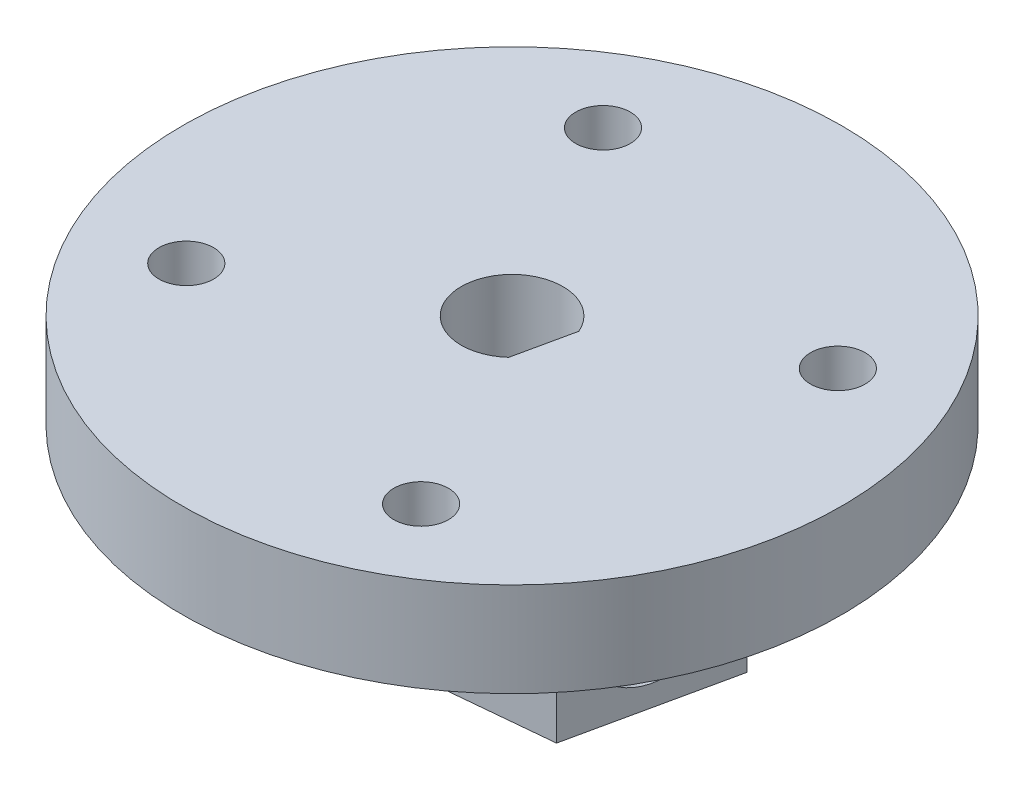
ISO-10303-21;
HEADER;
FILE_DESCRIPTION(('STEP AP214'),'2;1');
FILE_NAME('part.step','',(''),(''),'','','');
FILE_SCHEMA(('AUTOMOTIVE_DESIGN { 1 0 10303 214 1 1 1 1 }'));
ENDSEC;
DATA;
#1=APPLICATION_CONTEXT('core data for automotive mechanical design processes');
#2=APPLICATION_PROTOCOL_DEFINITION('international standard','automotive_design',2000,#1);
#3=PRODUCT_CONTEXT('',#1,'mechanical');
#4=PRODUCT('Part','Part','',(#3));
#5=PRODUCT_RELATED_PRODUCT_CATEGORY('part','',(#4));
#6=PRODUCT_DEFINITION_FORMATION('','',#4);
#7=PRODUCT_DEFINITION_CONTEXT('part definition',#1,'design');
#8=PRODUCT_DEFINITION('design','',#6,#7);
#9=PRODUCT_DEFINITION_SHAPE('','',#8);
#10=(LENGTH_UNIT() NAMED_UNIT(*) SI_UNIT(.MILLI.,.METRE.));
#11=(NAMED_UNIT(*) PLANE_ANGLE_UNIT() SI_UNIT($,.RADIAN.));
#12=(NAMED_UNIT(*) SI_UNIT($,.STERADIAN.) SOLID_ANGLE_UNIT());
#13=UNCERTAINTY_MEASURE_WITH_UNIT(LENGTH_MEASURE(1.E-05),#10,'distance_accuracy_value','');
#14=(GEOMETRIC_REPRESENTATION_CONTEXT(3) GLOBAL_UNCERTAINTY_ASSIGNED_CONTEXT((#13)) GLOBAL_UNIT_ASSIGNED_CONTEXT((#10,
#11,#12)) REPRESENTATION_CONTEXT('',''));
#15=CARTESIAN_POINT('',(0.,0.,0.));
#16=DIRECTION('',(0.,0.,1.));
#17=DIRECTION('',(1.,0.,0.));
#18=AXIS2_PLACEMENT_3D('',#15,#16,#17);
#19=CARTESIAN_POINT('',(0.,10.,0.));
#20=DIRECTION('',(0.,-1.,0.));
#21=DIRECTION('',(0.,0.,-1.));
#22=AXIS2_PLACEMENT_3D('',#19,#20,#21);
#23=PLANE('',#22);
#24=CARTESIAN_POINT('',(0.,10.,1.08481243826419E-13));
#25=DIRECTION('',(0.,-1.,0.));
#26=DIRECTION('',(0.,0.,-1.));
#27=AXIS2_PLACEMENT_3D('',#24,#25,#26);
#28=CIRCLE('',#27,17.5);
#29=CARTESIAN_POINT('',(0.,10.,-17.4999999999999));
#30=VERTEX_POINT('',#29);
#31=EDGE_CURVE('E300',#30,#30,#28,.T.);
#32=ORIENTED_EDGE('',*,*,#31,.T.);
#33=EDGE_LOOP('',(#32));
#34=FACE_BOUND('',#33,.T.);
#35=CARTESIAN_POINT('',(11.0643329124599,10.,-6.23462406262448));
#36=DIRECTION('',(0.,-1.,0.));
#37=DIRECTION('',(0.,0.,-1.));
#38=AXIS2_PLACEMENT_3D('',#35,#36,#37);
#39=CIRCLE('',#38,1.45);
#40=CARTESIAN_POINT('',(11.0643329124599,10.,-7.68462406262448));
#41=VERTEX_POINT('',#40);
#42=EDGE_CURVE('E296',#41,#41,#39,.T.);
#43=ORIENTED_EDGE('',*,*,#42,.F.);
#44=EDGE_LOOP('',(#43));
#45=FACE_BOUND('',#44,.T.);
#46=CARTESIAN_POINT('',(-6.23462406262453,10.,-11.0643329124599));
#47=DIRECTION('',(0.,-1.,0.));
#48=DIRECTION('',(0.,0.,-1.));
#49=AXIS2_PLACEMENT_3D('',#46,#47,#48);
#50=CIRCLE('',#49,1.4500000000001);
#51=CARTESIAN_POINT('',(-6.23462406262453,10.,-12.51433291246));
#52=VERTEX_POINT('',#51);
#53=EDGE_CURVE('E293',#52,#52,#50,.T.);
#54=ORIENTED_EDGE('',*,*,#53,.F.);
#55=EDGE_LOOP('',(#54));
#56=FACE_BOUND('',#55,.T.);
#57=CARTESIAN_POINT('',(-11.06433291246,10.,6.23462406262441));
#58=DIRECTION('',(0.,-1.,0.));
#59=DIRECTION('',(0.,0.,-1.));
#60=AXIS2_PLACEMENT_3D('',#57,#58,#59);
#61=CIRCLE('',#60,1.45);
#62=CARTESIAN_POINT('',(-11.06433291246,10.,4.78462406262441));
#63=VERTEX_POINT('',#62);
#64=EDGE_CURVE('E288',#63,#63,#61,.T.);
#65=ORIENTED_EDGE('',*,*,#64,.F.);
#66=EDGE_LOOP('',(#65));
#67=FACE_BOUND('',#66,.T.);
#68=CARTESIAN_POINT('',(6.23462406262441,10.,11.06433291246));
#69=DIRECTION('',(0.,-1.,0.));
#70=DIRECTION('',(0.,0.,-1.));
#71=AXIS2_PLACEMENT_3D('',#68,#69,#70);
#72=CIRCLE('',#71,1.45);
#73=CARTESIAN_POINT('',(6.23462406262441,10.,9.61433291245996));
#74=VERTEX_POINT('',#73);
#75=EDGE_CURVE('E284',#74,#74,#72,.T.);
#76=ORIENTED_EDGE('',*,*,#75,.F.);
#77=EDGE_LOOP('',(#76));
#78=FACE_BOUND('',#77,.T.);
#79=DIRECTION('',(-0.211873077029416,0.,0.97729719084324));
#80=VECTOR('',#79,1.);
#81=CARTESIAN_POINT('',(10.1682887570576,10.,-1.12067111727627));
#82=LINE('',#81,#80);
#83=CARTESIAN_POINT('',(10.3801618340876,10.,-2.09796830812233));
#84=VERTEX_POINT('',#83);
#85=CARTESIAN_POINT('',(8.5775136967429,10.,6.21702378717451));
#86=VERTEX_POINT('',#85);
#87=EDGE_CURVE('E221',#84,#86,#82,.T.);
#88=ORIENTED_EDGE('',*,*,#87,.F.);
#89=DIRECTION('',(0.866473418839005,0.,0.499223211044365));
#90=VECTOR('',#89,1.);
#91=CARTESIAN_POINT('',(3.49448833993198,10.,-6.06518525582902));
#92=LINE('',#91,#90);
#93=CARTESIAN_POINT('',(3.53399662575893,10.,-6.04242234944949));
#94=VERTEX_POINT('',#93);
#95=EDGE_CURVE('E198',#94,#84,#92,.T.);
#96=ORIENTED_EDGE('',*,*,#95,.F.);
#97=CARTESIAN_POINT('',(0.,10.,0.));
#98=DIRECTION('',(0.,-1.,0.));
#99=DIRECTION('',(0.,0.,-1.));
#100=AXIS2_PLACEMENT_3D('',#97,#98,#99);
#101=CIRCLE('',#100,7.00000000000016);
#102=CARTESIAN_POINT('',(0.699575959811636,10.,6.96495466435036));
#103=VERTEX_POINT('',#102);
#104=EDGE_CURVE('E279',#103,#94,#101,.T.);
#105=ORIENTED_EDGE('',*,*,#104,.F.);
#106=DIRECTION('',(0.995523444357466,0.,-0.0945149286337774));
#107=VECTOR('',#106,1.);
#108=CARTESIAN_POINT('',(0.661594673640218,10.,6.96856060509667));
#109=LINE('',#108,#107);
#110=EDGE_CURVE('E208',#103,#86,#109,.T.);
#111=ORIENTED_EDGE('',*,*,#110,.T.);
#112=EDGE_LOOP('',(#88,#96,#105,#111));
#113=FACE_BOUND('',#112,.T.);
#114=ADVANCED_FACE('F41',(#34,#45,#56,#67,#78,#113),#23,.T.);
#115=CARTESIAN_POINT('',(0.,-15.8714319372794,0.));
#116=DIRECTION('',(0.,1.,0.));
#117=DIRECTION('',(0.,0.,1.));
#118=AXIS2_PLACEMENT_3D('',#115,#116,#117);
#119=CYLINDRICAL_SURFACE('',#118,7.00000000000016);
#120=DIRECTION('',(0.,-1.,0.));
#121=VECTOR('',#120,1.);
#122=CARTESIAN_POINT('',(3.53399662575893,18.4600914467693,-6.04242234944949));
#123=LINE('',#122,#121);
#124=CARTESIAN_POINT('',(3.53399662575893,2.75,-6.04242234944949));
#125=VERTEX_POINT('',#124);
#126=EDGE_CURVE('E197',#94,#125,#123,.T.);
#127=ORIENTED_EDGE('',*,*,#126,.T.);
#128=CARTESIAN_POINT('',(0.,2.75,0.));
#129=DIRECTION('',(0.,-1.,0.));
#130=DIRECTION('',(0.,0.,-1.));
#131=AXIS2_PLACEMENT_3D('',#128,#129,#130);
#132=CIRCLE('',#131,7.00000000000015);
#133=CARTESIAN_POINT('',(0.699575959811636,2.75,6.96495466435036));
#134=VERTEX_POINT('',#133);
#135=EDGE_CURVE('E189',#134,#125,#132,.T.);
#136=ORIENTED_EDGE('',*,*,#135,.F.);
#137=DIRECTION('',(0.,-1.,0.));
#138=VECTOR('',#137,1.);
#139=CARTESIAN_POINT('',(0.699575959811636,18.4600914467693,6.96495466435036));
#140=LINE('',#139,#138);
#141=EDGE_CURVE('E213',#103,#134,#140,.T.);
#142=ORIENTED_EDGE('',*,*,#141,.F.);
#143=ORIENTED_EDGE('',*,*,#104,.T.);
#144=EDGE_LOOP('',(#127,#136,#142,#143));
#145=FACE_BOUND('',#144,.T.);
#146=ADVANCED_FACE('F266',(#145),#119,.T.);
#147=CARTESIAN_POINT('',(-0.781837752674611,6.87499999999999,-0.169498461623525));
#148=DIRECTION('',(0.97729719084324,0.,0.211873077029416));
#149=DIRECTION('',(0.211873077029416,0.,-0.97729719084324));
#150=AXIS2_PLACEMENT_3D('',#147,#148,#149);
#151=CYLINDRICAL_SURFACE('',#150,1.7);
#152=CARTESIAN_POINT('',(5.47286426872212,6.87499999999999,1.18648923136474));
#153=DIRECTION('',(0.977297190843239,0.,0.211873077029417));
#154=DIRECTION('',(0.211873077029417,0.,-0.977297190843239));
#155=AXIS2_PLACEMENT_3D('',#152,#153,#154);
#156=CIRCLE('',#155,1.7);
#157=CARTESIAN_POINT('',(5.83304849967213,6.87499999999999,-0.474915993068771));
#158=VERTEX_POINT('',#157);
#159=EDGE_CURVE('E255',#158,#158,#156,.F.);
#160=ORIENTED_EDGE('',*,*,#159,.T.);
#161=EDGE_LOOP('',(#160));
#162=FACE_BOUND('',#161,.T.);
#163=CARTESIAN_POINT('',(6.54789117864969,6.87499999999999,1.41954961609709));
#164=DIRECTION('',(0.97729719084324,0.,0.211873077029416));
#165=DIRECTION('',(0.211873077029416,0.,-0.97729719084324));
#166=AXIS2_PLACEMENT_3D('',#163,#164,#165);
#167=CIRCLE('',#166,1.7);
#168=CARTESIAN_POINT('',(6.90807540959969,6.87499999999999,-0.241855608336414));
#169=VERTEX_POINT('',#168);
#170=EDGE_CURVE('E45',#169,#169,#167,.F.);
#171=ORIENTED_EDGE('',*,*,#170,.F.);
#172=EDGE_LOOP('',(#171));
#173=FACE_BOUND('',#172,.T.);
#174=ADVANCED_FACE('F260',(#162,#173),#151,.F.);
#175=CARTESIAN_POINT('',(2.1500538198551,6.87499999999999,0.466120769464721));
#176=DIRECTION('',(0.977297190843239,0.,0.211873077029416));
#177=DIRECTION('',(0.211873077029416,0.,-0.977297190843239));
#178=AXIS2_PLACEMENT_3D('',#175,#176,#177);
#179=CIRCLE('',#178,1.7);
#180=CARTESIAN_POINT('',(2.48168764184298,7.53832495807103,-1.06359129759684));
#181=VERTEX_POINT('',#180);
#182=CARTESIAN_POINT('',(1.81841999786719,7.53832495807062,1.99583283652646));
#183=VERTEX_POINT('',#182);
#184=EDGE_CURVE('E59',#181,#183,#179,.T.);
#185=ORIENTED_EDGE('',*,*,#184,.F.);
#186=CARTESIAN_POINT('',(2.48168764184298,6.21167504192895,-1.06359129759684));
#187=CARTESIAN_POINT('',(2.47445290257998,6.24699142231365,-1.08047131098492));
#188=CARTESIAN_POINT('',(2.46754206408533,6.28295353629968,-1.09612227637523));
#189=CARTESIAN_POINT('',(2.45459933639451,6.35609595390477,-1.12480636760794));
#190=CARTESIAN_POINT('',(2.44856823320057,6.39327731097775,-1.13783715633157));
#191=CARTESIAN_POINT('',(2.43219337228819,6.50621811610238,-1.17264760187369));
#192=CARTESIAN_POINT('',(2.42352185429033,6.58358733933576,-1.19024858600394));
#193=CARTESIAN_POINT('',(2.41219775727491,6.74107215220095,-1.21304415122782));
#194=CARTESIAN_POINT('',(2.40958248542305,6.82120169476091,-1.21816184406719));
#195=CARTESIAN_POINT('',(2.41101179546206,6.98117662212737,-1.21532758054758));
#196=CARTESIAN_POINT('',(2.41505579519047,7.06102203116167,-1.20737676665514));
#197=CARTESIAN_POINT('',(2.42819073000947,7.20888705818493,-1.18071188537276));
#198=CARTESIAN_POINT('',(2.43665278423215,7.27721610205841,-1.16333021064468));
#199=CARTESIAN_POINT('',(2.45694675597383,7.41054720697866,-1.11979999022931));
#200=CARTESIAN_POINT('',(2.46877984205136,7.47554810509935,-1.09364840391944));
#201=CARTESIAN_POINT('',(2.48168764184298,7.53832495807103,-1.06359129759684));
#202=B_SPLINE_CURVE_WITH_KNOTS('',3,(#186,#187,#188,#189,#190,#191,#192,#193,#194,#195,#196,
#197,#198,#199,#200,#201),.UNSPECIFIED.,.F.,.F.,(4,2,2,2,2,2,2,4),(0.,0.119371190949202,
0.238848389642147,0.477087032550907,0.716789392903389,0.956470799266007,1.16878940235321,
1.38118169481965),.UNSPECIFIED.);
#203=CARTESIAN_POINT('',(2.48168764184298,6.21167504192895,-1.06359129759684));
#204=VERTEX_POINT('',#203);
#205=EDGE_CURVE('E246',#204,#181,#202,.T.);
#206=ORIENTED_EDGE('',*,*,#205,.F.);
#207=CARTESIAN_POINT('',(1.81841999786719,6.21167504192937,1.99583283652646));
#208=VERTEX_POINT('',#207);
#209=EDGE_CURVE('E254',#208,#204,#179,.T.);
#210=ORIENTED_EDGE('',*,*,#209,.F.);
#211=CARTESIAN_POINT('',(1.81841999786719,7.53832495807062,1.99583283652646));
#212=CARTESIAN_POINT('',(1.80484434522516,7.50300857768591,2.00820126243795));
#213=CARTESIAN_POINT('',(1.79207249405061,7.46704646369987,2.01958512048004));
#214=CARTESIAN_POINT('',(1.76841294380592,7.39390404609478,2.04033402339423));
#215=CARTESIAN_POINT('',(1.75752692803188,7.3567226890218,2.04969726647892));
#216=CARTESIAN_POINT('',(1.72820630071307,7.24378188389716,2.07460116180412));
#217=CARTESIAN_POINT('',(1.71302429123172,7.16641266066378,2.08703082209102));
#218=CARTESIAN_POINT('',(1.69327664163661,7.00892784779859,2.1030901901532));
#219=CARTESIAN_POINT('',(1.68877680065572,6.92879830523863,2.10666536259711));
#220=CARTESIAN_POINT('',(1.69125152867011,6.76882337787219,2.10467747473777));
#221=CARTESIAN_POINT('',(1.69822509464469,6.68897796883789,2.09911521324138));
#222=CARTESIAN_POINT('',(1.72122338839398,6.54111294181479,2.0802838327523));
#223=CARTESIAN_POINT('',(1.73612391813274,6.47278389794146,2.06796704780153));
#224=CARTESIAN_POINT('',(1.7726228817807,6.33945279302149,2.03674924789381));
#225=CARTESIAN_POINT('',(1.79422363853542,6.27445189490093,2.017845949233));
#226=CARTESIAN_POINT('',(1.81841999786719,6.21167504192937,1.99583283652646));
#227=B_SPLINE_CURVE_WITH_KNOTS('',3,(#211,#212,#213,#214,#215,#216,#217,#218,#219,#220,#221,
#222,#223,#224,#225,#226),.UNSPECIFIED.,.F.,.F.,(4,2,2,2,2,2,2,4),(0.,0.119371190949195,
0.238848389642134,0.47708703255088,0.716789392903349,0.95647079926595,1.16878940235271,
1.3811816948187),.UNSPECIFIED.);
#228=EDGE_CURVE('E271',#183,#208,#227,.T.);
#229=ORIENTED_EDGE('',*,*,#228,.F.);
#230=EDGE_LOOP('',(#185,#206,#210,#229));
#231=FACE_BOUND('',#230,.T.);
#232=CARTESIAN_POINT('',(2.9318915725297,6.87499999999999,0.635619231088254));
#233=DIRECTION('',(0.977297190843239,0.,0.211873077029417));
#234=DIRECTION('',(0.211873077029417,0.,-0.977297190843239));
#235=AXIS2_PLACEMENT_3D('',#232,#233,#234);
#236=CIRCLE('',#235,1.7);
#237=CARTESIAN_POINT('',(3.29207580347971,6.87499999999999,-1.02578599334525));
#238=VERTEX_POINT('',#237);
#239=EDGE_CURVE('E240',#238,#238,#236,.F.);
#240=ORIENTED_EDGE('',*,*,#239,.F.);
#241=EDGE_LOOP('',(#240));
#242=FACE_BOUND('',#241,.T.);
#243=ADVANCED_FACE('F265',(#231,#242),#151,.F.);
#244=CARTESIAN_POINT('',(2.15005381985511,10.,0.466120769464712));
#245=DIRECTION('',(0.977297190843239,0.,0.211873077029416));
#246=DIRECTION('',(0.211873077029416,0.,-0.977297190843239));
#247=AXIS2_PLACEMENT_3D('',#244,#245,#246);
#248=PLANE('',#247);
#249=DIRECTION('',(0.,1.,0.));
#250=VECTOR('',#249,1.);
#251=CARTESIAN_POINT('',(2.48168764184298,10.,-1.06359129759684));
#252=LINE('',#251,#250);
#253=CARTESIAN_POINT('',(2.48168764184298,15.,-1.06359129759684));
#254=VERTEX_POINT('',#253);
#255=EDGE_CURVE('E51',#181,#254,#252,.T.);
#256=ORIENTED_EDGE('',*,*,#255,.F.);
#257=ORIENTED_EDGE('',*,*,#184,.T.);
#258=DIRECTION('',(0.,1.,0.));
#259=VECTOR('',#258,1.);
#260=CARTESIAN_POINT('',(1.81841999786719,10.,1.99583283652646));
#261=LINE('',#260,#259);
#262=CARTESIAN_POINT('',(1.81841999786719,15.,1.99583283652646));
#263=VERTEX_POINT('',#262);
#264=EDGE_CURVE('E66',#183,#263,#261,.T.);
#265=ORIENTED_EDGE('',*,*,#264,.T.);
#266=DIRECTION('',(0.211873077029416,0.,-0.97729719084324));
#267=VECTOR('',#266,1.);
#268=CARTESIAN_POINT('',(2.15005381985511,15.,0.466120769464713));
#269=LINE('',#268,#267);
#270=EDGE_CURVE('E283',#263,#254,#269,.T.);
#271=ORIENTED_EDGE('',*,*,#270,.T.);
#272=EDGE_LOOP('',(#256,#257,#265,#271));
#273=FACE_BOUND('',#272,.T.);
#274=ADVANCED_FACE('F498',(#273),#248,.F.);
#275=CARTESIAN_POINT('',(1.81841999786718,2.75,1.99583283652646));
#276=VERTEX_POINT('',#275);
#277=EDGE_CURVE('E328',#276,#208,#261,.T.);
#278=ORIENTED_EDGE('',*,*,#277,.T.);
#279=ORIENTED_EDGE('',*,*,#209,.T.);
#280=CARTESIAN_POINT('',(2.48168764184298,2.75,-1.06359129759684));
#281=VERTEX_POINT('',#280);
#282=EDGE_CURVE('E11',#281,#204,#252,.T.);
#283=ORIENTED_EDGE('',*,*,#282,.F.);
#284=DIRECTION('',(-0.211873077029417,0.,0.977297190843239));
#285=VECTOR('',#284,1.);
#286=CARTESIAN_POINT('',(1.81841999786718,2.75,1.99583283652646));
#287=LINE('',#286,#285);
#288=EDGE_CURVE('E177',#281,#276,#287,.T.);
#289=ORIENTED_EDGE('',*,*,#288,.T.);
#290=EDGE_LOOP('',(#278,#279,#283,#289));
#291=FACE_BOUND('',#290,.T.);
#292=ADVANCED_FACE('F43',(#291),#248,.F.);
#293=CARTESIAN_POINT('',(11.0643329124599,10.,-6.23462406262448));
#294=DIRECTION('',(0.,1.,0.));
#295=DIRECTION('',(0.,0.,1.));
#296=AXIS2_PLACEMENT_3D('',#293,#294,#295);
#297=CYLINDRICAL_SURFACE('',#296,1.45);
#298=ORIENTED_EDGE('',*,*,#42,.T.);
#299=EDGE_LOOP('',(#298));
#300=FACE_BOUND('',#299,.T.);
#301=CARTESIAN_POINT('',(11.0643329124599,15.,-6.23462406262448));
#302=DIRECTION('',(0.,-1.,0.));
#303=DIRECTION('',(0.,0.,-1.));
#304=AXIS2_PLACEMENT_3D('',#301,#302,#303);
#305=CIRCLE('',#304,1.45);
#306=CARTESIAN_POINT('',(11.0643329124599,15.,-7.68462406262448));
#307=VERTEX_POINT('',#306);
#308=EDGE_CURVE('E321',#307,#307,#305,.T.);
#309=ORIENTED_EDGE('',*,*,#308,.F.);
#310=EDGE_LOOP('',(#309));
#311=FACE_BOUND('',#310,.T.);
#312=ADVANCED_FACE('F365',(#300,#311),#297,.F.);
#313=CARTESIAN_POINT('',(-6.23462406262453,10.,-11.0643329124599));
#314=DIRECTION('',(0.,1.,0.));
#315=DIRECTION('',(0.,0.,1.));
#316=AXIS2_PLACEMENT_3D('',#313,#314,#315);
#317=CYLINDRICAL_SURFACE('',#316,1.4500000000001);
#318=ORIENTED_EDGE('',*,*,#53,.T.);
#319=EDGE_LOOP('',(#318));
#320=FACE_BOUND('',#319,.T.);
#321=CARTESIAN_POINT('',(-6.23462406262453,15.,-11.0643329124599));
#322=DIRECTION('',(0.,-1.,0.));
#323=DIRECTION('',(0.,0.,-1.));
#324=AXIS2_PLACEMENT_3D('',#321,#322,#323);
#325=CIRCLE('',#324,1.4500000000001);
#326=CARTESIAN_POINT('',(-6.23462406262453,15.,-12.51433291246));
#327=VERTEX_POINT('',#326);
#328=EDGE_CURVE('E317',#327,#327,#325,.T.);
#329=ORIENTED_EDGE('',*,*,#328,.F.);
#330=EDGE_LOOP('',(#329));
#331=FACE_BOUND('',#330,.T.);
#332=ADVANCED_FACE('F368',(#320,#331),#317,.F.);
#333=CARTESIAN_POINT('',(-11.06433291246,10.,6.23462406262441));
#334=DIRECTION('',(0.,1.,0.));
#335=DIRECTION('',(0.,0.,1.));
#336=AXIS2_PLACEMENT_3D('',#333,#334,#335);
#337=CYLINDRICAL_SURFACE('',#336,1.45);
#338=ORIENTED_EDGE('',*,*,#64,.T.);
#339=EDGE_LOOP('',(#338));
#340=FACE_BOUND('',#339,.T.);
#341=CARTESIAN_POINT('',(-11.06433291246,15.,6.23462406262441));
#342=DIRECTION('',(0.,-1.,0.));
#343=DIRECTION('',(0.,0.,-1.));
#344=AXIS2_PLACEMENT_3D('',#341,#342,#343);
#345=CIRCLE('',#344,1.45);
#346=CARTESIAN_POINT('',(-11.06433291246,15.,4.78462406262441));
#347=VERTEX_POINT('',#346);
#348=EDGE_CURVE('E313',#347,#347,#345,.T.);
#349=ORIENTED_EDGE('',*,*,#348,.F.);
#350=EDGE_LOOP('',(#349));
#351=FACE_BOUND('',#350,.T.);
#352=ADVANCED_FACE('F372',(#340,#351),#337,.F.);
#353=CARTESIAN_POINT('',(6.23462406262441,10.,11.06433291246));
#354=DIRECTION('',(0.,1.,0.));
#355=DIRECTION('',(0.,0.,1.));
#356=AXIS2_PLACEMENT_3D('',#353,#354,#355);
#357=CYLINDRICAL_SURFACE('',#356,1.45);
#358=ORIENTED_EDGE('',*,*,#75,.T.);
#359=EDGE_LOOP('',(#358));
#360=FACE_BOUND('',#359,.T.);
#361=CARTESIAN_POINT('',(6.23462406262441,15.,11.06433291246));
#362=DIRECTION('',(0.,-1.,0.));
#363=DIRECTION('',(0.,0.,-1.));
#364=AXIS2_PLACEMENT_3D('',#361,#362,#363);
#365=CIRCLE('',#364,1.45);
#366=CARTESIAN_POINT('',(6.23462406262441,15.,9.61433291245996));
#367=VERTEX_POINT('',#366);
#368=EDGE_CURVE('E309',#367,#367,#365,.T.);
#369=ORIENTED_EDGE('',*,*,#368,.F.);
#370=EDGE_LOOP('',(#369));
#371=FACE_BOUND('',#370,.T.);
#372=ADVANCED_FACE('F375',(#360,#371),#357,.F.);
#373=CARTESIAN_POINT('',(0.,10.,1.08481243826419E-13));
#374=DIRECTION('',(0.,1.,0.));
#375=DIRECTION('',(0.,0.,1.));
#376=AXIS2_PLACEMENT_3D('',#373,#374,#375);
#377=CYLINDRICAL_SURFACE('',#376,2.7);
#378=ORIENTED_EDGE('',*,*,#264,.F.);
#379=ORIENTED_EDGE('',*,*,#228,.T.);
#380=ORIENTED_EDGE('',*,*,#277,.F.);
#381=CARTESIAN_POINT('',(0.,2.75,1.07990003563114E-13));
#382=DIRECTION('',(0.,-1.,0.));
#383=DIRECTION('',(0.,0.,-1.));
#384=AXIS2_PLACEMENT_3D('',#381,#382,#383);
#385=CIRCLE('',#384,2.7);
#386=EDGE_CURVE('E173',#276,#281,#385,.T.);
#387=ORIENTED_EDGE('',*,*,#386,.T.);
#388=ORIENTED_EDGE('',*,*,#282,.T.);
#389=ORIENTED_EDGE('',*,*,#205,.T.);
#390=ORIENTED_EDGE('',*,*,#255,.T.);
#391=CARTESIAN_POINT('',(0.,15.,1.08914924695413E-13));
#392=DIRECTION('',(0.,-1.,0.));
#393=DIRECTION('',(0.,0.,-1.));
#394=AXIS2_PLACEMENT_3D('',#391,#392,#393);
#395=CIRCLE('',#394,2.7);
#396=EDGE_CURVE('E306',#254,#263,#395,.F.);
#397=ORIENTED_EDGE('',*,*,#396,.T.);
#398=EDGE_LOOP('',(#378,#379,#380,#387,#388,#389,#390,#397));
#399=FACE_BOUND('',#398,.T.);
#400=ADVANCED_FACE('F257',(#399),#377,.F.);
#401=CARTESIAN_POINT('',(0.,10.,1.08481243826419E-13));
#402=DIRECTION('',(0.,1.,0.));
#403=DIRECTION('',(0.,0.,1.));
#404=AXIS2_PLACEMENT_3D('',#401,#402,#403);
#405=CYLINDRICAL_SURFACE('',#404,17.5);
#406=ORIENTED_EDGE('',*,*,#31,.F.);
#407=EDGE_LOOP('',(#406));
#408=FACE_BOUND('',#407,.T.);
#409=CARTESIAN_POINT('',(0.,15.,1.08914924695413E-13));
#410=DIRECTION('',(0.,-1.,0.));
#411=DIRECTION('',(0.,0.,-1.));
#412=AXIS2_PLACEMENT_3D('',#409,#410,#411);
#413=CIRCLE('',#412,17.5);
#414=CARTESIAN_POINT('',(0.,15.,-17.4999999999999));
#415=VERTEX_POINT('',#414);
#416=EDGE_CURVE('E289',#415,#415,#413,.T.);
#417=ORIENTED_EDGE('',*,*,#416,.T.);
#418=EDGE_LOOP('',(#417));
#419=FACE_BOUND('',#418,.T.);
#420=ADVANCED_FACE('F349',(#408,#419),#405,.T.);
#421=CARTESIAN_POINT('',(0.,15.,0.));
#422=DIRECTION('',(0.,-1.,0.));
#423=DIRECTION('',(0.,0.,-1.));
#424=AXIS2_PLACEMENT_3D('',#421,#422,#423);
#425=PLANE('',#424);
#426=ORIENTED_EDGE('',*,*,#270,.F.);
#427=ORIENTED_EDGE('',*,*,#396,.F.);
#428=EDGE_LOOP('',(#426,#427));
#429=FACE_BOUND('',#428,.T.);
#430=ORIENTED_EDGE('',*,*,#368,.T.);
#431=EDGE_LOOP('',(#430));
#432=FACE_BOUND('',#431,.T.);
#433=ORIENTED_EDGE('',*,*,#348,.T.);
#434=EDGE_LOOP('',(#433));
#435=FACE_BOUND('',#434,.T.);
#436=ORIENTED_EDGE('',*,*,#328,.T.);
#437=EDGE_LOOP('',(#436));
#438=FACE_BOUND('',#437,.T.);
#439=ORIENTED_EDGE('',*,*,#308,.T.);
#440=EDGE_LOOP('',(#439));
#441=FACE_BOUND('',#440,.T.);
#442=ORIENTED_EDGE('',*,*,#416,.F.);
#443=EDGE_LOOP('',(#442));
#444=FACE_BOUND('',#443,.T.);
#445=ADVANCED_FACE('F342',(#429,#432,#435,#438,#441,#444),#425,.F.);
#446=CARTESIAN_POINT('',(5.47286426872212,9.6,1.18648923136473));
#447=DIRECTION('',(0.977297190843239,0.,0.211873077029417));
#448=DIRECTION('',(0.211873077029417,0.,-0.977297190843239));
#449=AXIS2_PLACEMENT_3D('',#446,#447,#448);
#450=PLANE('',#449);
#451=DIRECTION('',(0.,-1.,0.));
#452=VECTOR('',#451,1.);
#453=CARTESIAN_POINT('',(6.16145176906771,9.6,-1.9897266388757));
#454=LINE('',#453,#452);
#455=CARTESIAN_POINT('',(6.16145176906771,9.6,-1.9897266388757));
#456=VERTEX_POINT('',#455);
#457=CARTESIAN_POINT('',(6.16145176906771,2.75,-1.9897266388757));
#458=VERTEX_POINT('',#457);
#459=EDGE_CURVE('E241',#456,#458,#454,.T.);
#460=ORIENTED_EDGE('',*,*,#459,.T.);
#461=DIRECTION('',(-0.211873077029417,0.,0.977297190843239));
#462=VECTOR('',#461,1.);
#463=CARTESIAN_POINT('',(6.16145176906771,2.75,-1.9897266388757));
#464=LINE('',#463,#462);
#465=CARTESIAN_POINT('',(4.7842767683765,2.75,4.36270510160535));
#466=VERTEX_POINT('',#465);
#467=EDGE_CURVE('E168',#458,#466,#464,.T.);
#468=ORIENTED_EDGE('',*,*,#467,.T.);
#469=DIRECTION('',(0.,-1.,0.));
#470=VECTOR('',#469,1.);
#471=CARTESIAN_POINT('',(4.7842767683765,9.6,4.36270510160535));
#472=LINE('',#471,#470);
#473=CARTESIAN_POINT('',(4.7842767683765,9.6,4.36270510160535));
#474=VERTEX_POINT('',#473);
#475=EDGE_CURVE('E154',#474,#466,#472,.T.);
#476=ORIENTED_EDGE('',*,*,#475,.F.);
#477=DIRECTION('',(-0.211873077029417,0.,0.977297190843239));
#478=VECTOR('',#477,1.);
#479=CARTESIAN_POINT('',(5.47286426872212,9.6,1.18648923136473));
#480=LINE('',#479,#478);
#481=EDGE_CURVE('E148',#456,#474,#480,.T.);
#482=ORIENTED_EDGE('',*,*,#481,.F.);
#483=EDGE_LOOP('',(#460,#468,#476,#482));
#484=FACE_BOUND('',#483,.T.);
#485=ORIENTED_EDGE('',*,*,#159,.F.);
#486=EDGE_LOOP('',(#485));
#487=FACE_BOUND('',#486,.T.);
#488=ADVANCED_FACE('F340',(#484,#487),#450,.F.);
#489=CARTESIAN_POINT('',(2.9318915725297,9.6,0.635619231088248));
#490=DIRECTION('',(0.977297190843239,0.,0.211873077029417));
#491=DIRECTION('',(0.211873077029417,0.,-0.977297190843239));
#492=AXIS2_PLACEMENT_3D('',#489,#490,#491);
#493=PLANE('',#492);
#494=DIRECTION('',(0.,-1.,0.));
#495=VECTOR('',#494,1.);
#496=CARTESIAN_POINT('',(2.24330407218407,9.6,3.81183510132887));
#497=LINE('',#496,#495);
#498=CARTESIAN_POINT('',(2.24330407218407,9.6,3.81183510132887));
#499=VERTEX_POINT('',#498);
#500=CARTESIAN_POINT('',(2.24330407218407,2.75,3.81183510132887));
#501=VERTEX_POINT('',#500);
#502=EDGE_CURVE('E134',#499,#501,#497,.T.);
#503=ORIENTED_EDGE('',*,*,#502,.T.);
#504=DIRECTION('',(0.211873077029417,0.,-0.977297190843239));
#505=VECTOR('',#504,1.);
#506=CARTESIAN_POINT('',(3.62047907287529,2.75,-2.54059663915219));
#507=LINE('',#506,#505);
#508=CARTESIAN_POINT('',(3.62047907287529,2.75,-2.54059663915219));
#509=VERTEX_POINT('',#508);
#510=EDGE_CURVE('E140',#501,#509,#507,.T.);
#511=ORIENTED_EDGE('',*,*,#510,.T.);
#512=DIRECTION('',(0.,-1.,0.));
#513=VECTOR('',#512,1.);
#514=CARTESIAN_POINT('',(3.62047907287529,9.6,-2.54059663915219));
#515=LINE('',#514,#513);
#516=CARTESIAN_POINT('',(3.62047907287529,9.6,-2.54059663915219));
#517=VERTEX_POINT('',#516);
#518=EDGE_CURVE('E147',#517,#509,#515,.T.);
#519=ORIENTED_EDGE('',*,*,#518,.F.);
#520=DIRECTION('',(-0.211873077029417,0.,0.977297190843239));
#521=VECTOR('',#520,1.);
#522=CARTESIAN_POINT('',(2.9318915725297,9.6,0.635619231088248));
#523=LINE('',#522,#521);
#524=EDGE_CURVE('E143',#517,#499,#523,.T.);
#525=ORIENTED_EDGE('',*,*,#524,.T.);
#526=EDGE_LOOP('',(#503,#511,#519,#525));
#527=FACE_BOUND('',#526,.T.);
#528=ORIENTED_EDGE('',*,*,#239,.T.);
#529=EDGE_LOOP('',(#528));
#530=FACE_BOUND('',#529,.T.);
#531=ADVANCED_FACE('F136',(#527,#530),#493,.T.);
#532=CARTESIAN_POINT('',(-0.688587500345626,9.6,3.17621587024062));
#533=DIRECTION('',(0.211873077029417,0.,-0.977297190843239));
#534=DIRECTION('',(-0.977297190843239,0.,-0.211873077029417));
#535=AXIS2_PLACEMENT_3D('',#532,#533,#534);
#536=PLANE('',#535);
#537=ORIENTED_EDGE('',*,*,#475,.T.);
#538=DIRECTION('',(-0.977297190843239,0.,-0.211873077029417));
#539=VECTOR('',#538,1.);
#540=CARTESIAN_POINT('',(2.24330407218407,2.75,3.81183510132887));
#541=LINE('',#540,#539);
#542=EDGE_CURVE('E151',#466,#501,#541,.T.);
#543=ORIENTED_EDGE('',*,*,#542,.T.);
#544=ORIENTED_EDGE('',*,*,#502,.F.);
#545=DIRECTION('',(0.977297190843239,0.,0.211873077029417));
#546=VECTOR('',#545,1.);
#547=CARTESIAN_POINT('',(-0.688587500345626,9.6,3.17621587024062));
#548=LINE('',#547,#546);
#549=EDGE_CURVE('E228',#499,#474,#548,.T.);
#550=ORIENTED_EDGE('',*,*,#549,.T.);
#551=EDGE_LOOP('',(#537,#543,#544,#550));
#552=FACE_BOUND('',#551,.T.);
#553=ADVANCED_FACE('F152',(#552),#536,.T.);
#554=CARTESIAN_POINT('',(0.688587500345586,9.6,-3.17621587024043));
#555=DIRECTION('',(-0.211873077029417,0.,0.977297190843239));
#556=DIRECTION('',(0.977297190843239,0.,0.211873077029417));
#557=AXIS2_PLACEMENT_3D('',#554,#555,#556);
#558=PLANE('',#557);
#559=ORIENTED_EDGE('',*,*,#518,.T.);
#560=DIRECTION('',(0.977297190843239,0.,0.211873077029417));
#561=VECTOR('',#560,1.);
#562=CARTESIAN_POINT('',(6.16145176906771,2.75,-1.9897266388757));
#563=LINE('',#562,#561);
#564=EDGE_CURVE('E162',#509,#458,#563,.T.);
#565=ORIENTED_EDGE('',*,*,#564,.T.);
#566=ORIENTED_EDGE('',*,*,#459,.F.);
#567=DIRECTION('',(-0.977297190843239,0.,-0.211873077029417));
#568=VECTOR('',#567,1.);
#569=CARTESIAN_POINT('',(0.688587500345586,9.6,-3.17621587024043));
#570=LINE('',#569,#568);
#571=EDGE_CURVE('E232',#456,#517,#570,.T.);
#572=ORIENTED_EDGE('',*,*,#571,.T.);
#573=EDGE_LOOP('',(#559,#565,#566,#572));
#574=FACE_BOUND('',#573,.T.);
#575=ADVANCED_FACE('F438',(#574),#558,.T.);
#576=CARTESIAN_POINT('',(0.,9.6,0.));
#577=DIRECTION('',(0.,-1.,0.));
#578=DIRECTION('',(0.,0.,-1.));
#579=AXIS2_PLACEMENT_3D('',#576,#577,#578);
#580=PLANE('',#579);
#581=ORIENTED_EDGE('',*,*,#549,.F.);
#582=ORIENTED_EDGE('',*,*,#524,.F.);
#583=ORIENTED_EDGE('',*,*,#571,.F.);
#584=ORIENTED_EDGE('',*,*,#481,.T.);
#585=EDGE_LOOP('',(#581,#582,#583,#584));
#586=FACE_BOUND('',#585,.T.);
#587=ADVANCED_FACE('F433',(#586),#580,.T.);
#588=CARTESIAN_POINT('',(6.54789117864969,6.87499999999999,1.41954961609709));
#589=DIRECTION('',(0.97729719084324,0.,0.211873077029416));
#590=DIRECTION('',(0.211873077029416,0.,-0.97729719084324));
#591=AXIS2_PLACEMENT_3D('',#588,#589,#590);
#592=PLANE('',#591);
#593=CARTESIAN_POINT('',(6.54789117864969,6.87499999999999,1.41954961609709));
#594=DIRECTION('',(0.97729719084324,0.,0.211873077029416));
#595=DIRECTION('',(0.211873077029416,0.,-0.97729719084324));
#596=AXIS2_PLACEMENT_3D('',#593,#594,#595);
#597=CIRCLE('',#596,3.);
#598=CARTESIAN_POINT('',(7.18351040973794,6.87499999999999,-1.51234195643263));
#599=VERTEX_POINT('',#598);
#600=EDGE_CURVE('E224',#599,#599,#597,.T.);
#601=ORIENTED_EDGE('',*,*,#600,.T.);
#602=EDGE_LOOP('',(#601));
#603=FACE_BOUND('',#602,.T.);
#604=ORIENTED_EDGE('',*,*,#170,.T.);
#605=EDGE_LOOP('',(#604));
#606=FACE_BOUND('',#605,.T.);
#607=ADVANCED_FACE('F430',(#603,#606),#592,.T.);
#608=CARTESIAN_POINT('',(6.54789117864969,6.87499999999999,1.41954961609709));
#609=DIRECTION('',(0.977297190843239,0.,0.211873077029416));
#610=DIRECTION('',(0.211873077029416,0.,-0.97729719084324));
#611=AXIS2_PLACEMENT_3D('',#608,#609,#610);
#612=CYLINDRICAL_SURFACE('',#611,3.);
#613=CARTESIAN_POINT('',(9.47978275117941,6.87499999999999,2.05516884718533));
#614=DIRECTION('',(0.97729719084324,0.,0.211873077029416));
#615=DIRECTION('',(0.211873077029416,0.,-0.97729719084324));
#616=AXIS2_PLACEMENT_3D('',#613,#614,#615);
#617=CIRCLE('',#616,3.);
#618=CARTESIAN_POINT('',(10.1154019822677,6.87499999999999,-0.876722725344385));
#619=VERTEX_POINT('',#618);
#620=EDGE_CURVE('E212',#619,#619,#617,.T.);
#621=CARTESIAN_POINT('',(7.18351040973794,6.87499999999999,-1.51234195643263));
#622=CARTESIAN_POINT('',(7.21405094695179,6.87499999999999,-1.50572092277546));
#623=CARTESIAN_POINT('',(7.24459148416564,6.87499999999999,-1.49909988911829));
#624=CARTESIAN_POINT('',(7.30567255859334,6.87499999999999,-1.48585782180396));
#625=CARTESIAN_POINT('',(7.33621309580719,6.87499999999999,-1.47923678814679));
#626=CARTESIAN_POINT('',(7.39729417023489,6.87499999999999,-1.46599472083245));
#627=CARTESIAN_POINT('',(7.42783470744874,6.87499999999999,-1.45937368717528));
#628=CARTESIAN_POINT('',(7.48891578187645,6.87499999999999,-1.44613161986094));
#629=CARTESIAN_POINT('',(7.5194563190903,6.87499999999999,-1.43951058620377));
#630=CARTESIAN_POINT('',(7.580537393518,6.87499999999999,-1.42626851888943));
#631=CARTESIAN_POINT('',(7.61107793073185,6.87499999999999,-1.41964748523226));
#632=CARTESIAN_POINT('',(7.67215900515955,6.87499999999999,-1.40640541791792));
#633=CARTESIAN_POINT('',(7.7026995423734,6.87499999999999,-1.39978438426076));
#634=CARTESIAN_POINT('',(7.76378061680111,6.87499999999999,-1.38654231694642));
#635=CARTESIAN_POINT('',(7.79432115401496,6.87499999999999,-1.37992128328925));
#636=CARTESIAN_POINT('',(7.85540222844266,6.87499999999999,-1.36667921597491));
#637=CARTESIAN_POINT('',(7.88594276565651,6.87499999999999,-1.36005818231774));
#638=CARTESIAN_POINT('',(7.94702384008422,6.87499999999999,-1.3468161150034));
#639=CARTESIAN_POINT('',(7.97756437729807,6.87499999999999,-1.34019508134623));
#640=CARTESIAN_POINT('',(8.03864545172577,6.87499999999999,-1.32695301403189));
#641=CARTESIAN_POINT('',(8.06918598893962,6.87499999999999,-1.32033198037472));
#642=CARTESIAN_POINT('',(8.13026706336732,6.87499999999999,-1.30708991306039));
#643=CARTESIAN_POINT('',(8.16080760058117,6.87499999999999,-1.30046887940322));
#644=CARTESIAN_POINT('',(8.22188867500888,6.87499999999999,-1.28722681208888));
#645=CARTESIAN_POINT('',(8.25242921222273,6.87499999999999,-1.28060577843171));
#646=CARTESIAN_POINT('',(8.31351028665043,6.87499999999999,-1.26736371111737));
#647=CARTESIAN_POINT('',(8.34405082386428,6.87499999999999,-1.2607426774602));
#648=CARTESIAN_POINT('',(8.40513189829198,6.87499999999999,-1.24750061014586));
#649=CARTESIAN_POINT('',(8.43567243550584,6.87499999999999,-1.24087957648869));
#650=CARTESIAN_POINT('',(8.49675350993354,6.87499999999999,-1.22763750917436));
#651=CARTESIAN_POINT('',(8.52729404714739,6.87499999999999,-1.22101647551719));
#652=CARTESIAN_POINT('',(8.58837512157509,6.87499999999999,-1.20777440820285));
#653=CARTESIAN_POINT('',(8.61891565878894,6.87499999999999,-1.20115337454568));
#654=CARTESIAN_POINT('',(8.67999673321664,6.87499999999999,-1.18791130723134));
#655=CARTESIAN_POINT('',(8.7105372704305,6.87499999999999,-1.18129027357417));
#656=CARTESIAN_POINT('',(8.7716183448582,6.87499999999999,-1.16804820625983));
#657=CARTESIAN_POINT('',(8.80215888207205,6.87499999999999,-1.16142717260266));
#658=CARTESIAN_POINT('',(8.86323995649975,6.87499999999999,-1.14818510528832));
#659=CARTESIAN_POINT('',(8.8937804937136,6.87499999999999,-1.14156407163116));
#660=CARTESIAN_POINT('',(8.95486156814131,6.87499999999999,-1.12832200431682));
#661=CARTESIAN_POINT('',(8.98540210535516,6.87499999999999,-1.12170097065965));
#662=CARTESIAN_POINT('',(9.04648317978286,6.87499999999999,-1.10845890334531));
#663=CARTESIAN_POINT('',(9.07702371699671,6.87499999999999,-1.10183786968814));
#664=CARTESIAN_POINT('',(9.13810479142441,6.87499999999999,-1.0885958023738));
#665=CARTESIAN_POINT('',(9.16864532863826,6.87499999999999,-1.08197476871663));
#666=CARTESIAN_POINT('',(9.22972640306597,6.87499999999999,-1.06873270140229));
#667=CARTESIAN_POINT('',(9.26026694027982,6.87499999999999,-1.06211166774512));
#668=CARTESIAN_POINT('',(9.32134801470752,6.87499999999999,-1.04886960043079));
#669=CARTESIAN_POINT('',(9.35188855192137,6.87499999999999,-1.04224856677362));
#670=CARTESIAN_POINT('',(9.41296962634908,6.87499999999999,-1.02900649945928));
#671=CARTESIAN_POINT('',(9.44351016356293,6.87499999999999,-1.02238546580211));
#672=CARTESIAN_POINT('',(9.50459123799063,6.87499999999999,-1.00914339848777));
#673=CARTESIAN_POINT('',(9.53513177520448,6.87499999999999,-1.0025223648306));
#674=CARTESIAN_POINT('',(9.59621284963218,6.87499999999999,-0.989280297516262));
#675=CARTESIAN_POINT('',(9.62675338684604,6.87499999999999,-0.982659263859093));
#676=CARTESIAN_POINT('',(9.68783446127374,6.87499999999999,-0.969417196544755));
#677=CARTESIAN_POINT('',(9.71837499848759,6.87499999999999,-0.962796162887585));
#678=CARTESIAN_POINT('',(9.77945607291529,6.87499999999999,-0.949554095573247));
#679=CARTESIAN_POINT('',(9.80999661012914,6.87499999999999,-0.942933061916078));
#680=CARTESIAN_POINT('',(9.87107768455684,6.87499999999999,-0.929690994601739));
#681=CARTESIAN_POINT('',(9.9016182217707,6.87499999999999,-0.92306996094457));
#682=CARTESIAN_POINT('',(9.9626992961984,6.87499999999999,-0.909827893630232));
#683=CARTESIAN_POINT('',(9.99323983341225,6.87499999999999,-0.903206859973062));
#684=CARTESIAN_POINT('',(10.05432090784,6.87499999999999,-0.889964792658724));
#685=CARTESIAN_POINT('',(10.0848614450538,6.87499999999999,-0.883343759001554));
#686=CARTESIAN_POINT('',(10.1154019822677,6.87499999999999,-0.876722725344385));
#687=B_SPLINE_CURVE_WITH_KNOTS('',3,(#621,#622,#623,#624,#625,#626,#627,#628,#629,#630,#631,
#632,#633,#634,#635,#636,#637,#638,#639,#640,#641,#642,#643,#644,#645,#646,#647,#648,#649,#650,
#651,#652,#653,#654,#655,#656,#657,#658,#659,#660,#661,#662,#663,#664,#665,#666,#667,#668,#669,
#670,#671,#672,#673,#674,#675,#676,#677,#678,#679,#680,#681,#682,#683,#684,#685,#686),
.UNSPECIFIED.,.F.,.F.,(4,2,2,2,2,2,2,2,2,2,2,2,2,2,2,2,2,2,2,2,2,2,2,2,2,2,2,2,2,2,2,2,4),(0.,
0.0937499999999997,0.187499999999999,0.281249999999999,0.375,0.46875,0.562499999999999,0.65625,
0.75,0.843749999999999,0.937499999999999,1.03125,1.125,1.21875,1.3125,1.40625,1.5,1.59375,
1.6875,1.78125,1.875,1.96875,2.0625,2.15625,2.25,2.34375,2.4375,2.53125,2.625,2.71875,2.8125,
2.90625,3.),.UNSPECIFIED.);
#688=EDGE_CURVE('BSEAM426',#599,#619,#687,.T.);
#689=ORIENTED_EDGE('',*,*,#600,.F.);
#690=ORIENTED_EDGE('',*,*,#620,.T.);
#691=ORIENTED_EDGE('',*,*,#688,.T.);
#692=ORIENTED_EDGE('',*,*,#688,.F.);
#693=EDGE_LOOP('',(#689,#691,#690,#692));
#694=FACE_BOUND('',#693,.T.);
#695=ADVANCED_FACE('F426',(#694),#612,.F.);
#696=CARTESIAN_POINT('',(9.47978275117941,0.,2.05516884718533));
#697=DIRECTION('',(0.97729719084324,0.,0.211873077029416));
#698=DIRECTION('',(0.211873077029416,0.,-0.97729719084324));
#699=AXIS2_PLACEMENT_3D('',#696,#697,#698);
#700=PLANE('',#699);
#701=ORIENTED_EDGE('',*,*,#87,.T.);
#702=DIRECTION('',(0.,-1.,0.));
#703=VECTOR('',#702,1.);
#704=CARTESIAN_POINT('',(8.5775136967429,18.4600914467693,6.21702378717451));
#705=LINE('',#704,#703);
#706=CARTESIAN_POINT('',(8.5775136967429,2.75,6.21702378717451));
#707=VERTEX_POINT('',#706);
#708=EDGE_CURVE('E202',#86,#707,#705,.T.);
#709=ORIENTED_EDGE('',*,*,#708,.T.);
#710=DIRECTION('',(-0.211873077029416,0.,0.97729719084324));
#711=VECTOR('',#710,1.);
#712=CARTESIAN_POINT('',(10.3801618340876,2.75,-2.09796830812233));
#713=LINE('',#712,#711);
#714=CARTESIAN_POINT('',(10.3801618340876,2.75,-2.09796830812233));
#715=VERTEX_POINT('',#714);
#716=EDGE_CURVE('E181',#715,#707,#713,.T.);
#717=ORIENTED_EDGE('',*,*,#716,.F.);
#718=DIRECTION('',(0.,-1.,0.));
#719=VECTOR('',#718,1.);
#720=CARTESIAN_POINT('',(10.3801618340876,18.4600914467693,-2.09796830812233));
#721=LINE('',#720,#719);
#722=EDGE_CURVE('E203',#84,#715,#721,.T.);
#723=ORIENTED_EDGE('',*,*,#722,.F.);
#724=EDGE_LOOP('',(#701,#709,#717,#723));
#725=FACE_BOUND('',#724,.T.);
#726=ORIENTED_EDGE('',*,*,#620,.F.);
#727=EDGE_LOOP('',(#726));
#728=FACE_BOUND('',#727,.T.);
#729=ADVANCED_FACE('F407',(#725,#728),#700,.T.);
#730=CARTESIAN_POINT('',(0.661594673640219,18.4600914467693,6.96856060509667));
#731=DIRECTION('',(0.0945149286337774,0.,0.995523444357466));
#732=DIRECTION('',(0.995523444357466,0.,-0.0945149286337774));
#733=AXIS2_PLACEMENT_3D('',#730,#731,#732);
#734=PLANE('',#733);
#735=ORIENTED_EDGE('',*,*,#110,.F.);
#736=ORIENTED_EDGE('',*,*,#141,.T.);
#737=DIRECTION('',(-0.995523444357466,0.,0.0945149286337774));
#738=VECTOR('',#737,1.);
#739=CARTESIAN_POINT('',(8.5775136967429,2.75,6.21702378717451));
#740=LINE('',#739,#738);
#741=EDGE_CURVE('E185',#707,#134,#740,.T.);
#742=ORIENTED_EDGE('',*,*,#741,.F.);
#743=ORIENTED_EDGE('',*,*,#708,.F.);
#744=EDGE_LOOP('',(#735,#736,#742,#743));
#745=FACE_BOUND('',#744,.T.);
#746=ADVANCED_FACE('F418',(#745),#734,.T.);
#747=CARTESIAN_POINT('',(3.49448833993198,18.4600914467693,-6.06518525582902));
#748=DIRECTION('',(-0.499223211044365,0.,0.866473418839005));
#749=DIRECTION('',(0.866473418839005,0.,0.499223211044365));
#750=AXIS2_PLACEMENT_3D('',#747,#748,#749);
#751=PLANE('',#750);
#752=ORIENTED_EDGE('',*,*,#126,.F.);
#753=ORIENTED_EDGE('',*,*,#95,.T.);
#754=ORIENTED_EDGE('',*,*,#722,.T.);
#755=DIRECTION('',(0.866473418839005,0.,0.499223211044365));
#756=VECTOR('',#755,1.);
#757=CARTESIAN_POINT('',(3.53399662575893,2.75,-6.04242234944949));
#758=LINE('',#757,#756);
#759=EDGE_CURVE('E193',#125,#715,#758,.T.);
#760=ORIENTED_EDGE('',*,*,#759,.F.);
#761=EDGE_LOOP('',(#752,#753,#754,#760));
#762=FACE_BOUND('',#761,.T.);
#763=ADVANCED_FACE('F411',(#762),#751,.F.);
#764=CARTESIAN_POINT('',(0.,2.75,0.));
#765=DIRECTION('',(0.,-1.,0.));
#766=DIRECTION('',(0.,0.,-1.));
#767=AXIS2_PLACEMENT_3D('',#764,#765,#766);
#768=PLANE('',#767);
#769=ORIENTED_EDGE('',*,*,#716,.T.);
#770=ORIENTED_EDGE('',*,*,#741,.T.);
#771=ORIENTED_EDGE('',*,*,#135,.T.);
#772=ORIENTED_EDGE('',*,*,#759,.T.);
#773=EDGE_LOOP('',(#769,#770,#771,#772));
#774=FACE_BOUND('',#773,.T.);
#775=ORIENTED_EDGE('',*,*,#288,.F.);
#776=ORIENTED_EDGE('',*,*,#386,.F.);
#777=EDGE_LOOP('',(#775,#776));
#778=FACE_BOUND('',#777,.T.);
#779=ORIENTED_EDGE('',*,*,#510,.F.);
#780=ORIENTED_EDGE('',*,*,#542,.F.);
#781=ORIENTED_EDGE('',*,*,#467,.F.);
#782=ORIENTED_EDGE('',*,*,#564,.F.);
#783=EDGE_LOOP('',(#779,#780,#781,#782));
#784=FACE_BOUND('',#783,.T.);
#785=ADVANCED_FACE('F160',(#774,#778,#784),#768,.T.);
#786=CLOSED_SHELL('',(#114,#146,#174,#243,#274,#292,#312,#332,#352,#372,#400,#420,#445,#488,
#531,#553,#575,#587,#607,#695,#729,#746,#763,#785));
#787=MANIFOLD_SOLID_BREP('B2',#786);
#788=ADVANCED_BREP_SHAPE_REPRESENTATION('',(#18,#787),#14);
#789=SHAPE_DEFINITION_REPRESENTATION(#9,#788);
ENDSEC;
END-ISO-10303-21;
